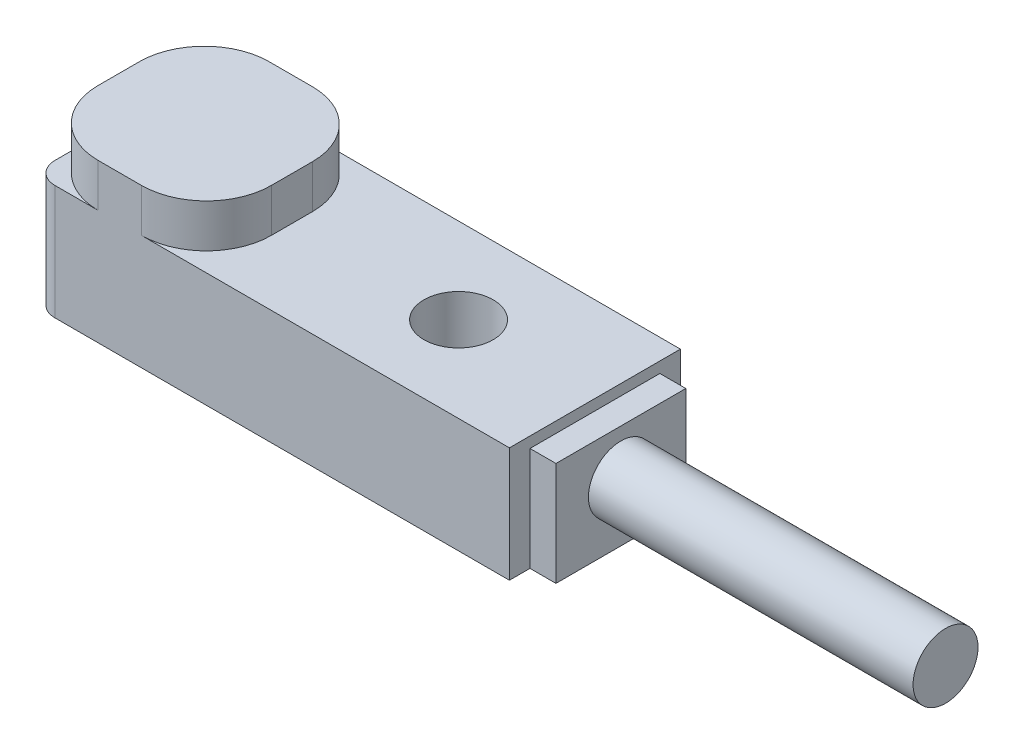
ISO-10303-21;
HEADER;
FILE_DESCRIPTION(('STEP AP214'),'2;1');
FILE_NAME('part.step','',(''),(''),'','','');
FILE_SCHEMA(('AUTOMOTIVE_DESIGN { 1 0 10303 214 1 1 1 1 }'));
ENDSEC;
DATA;
#1=APPLICATION_CONTEXT('core data for automotive mechanical design processes');
#2=APPLICATION_PROTOCOL_DEFINITION('international standard','automotive_design',2000,#1);
#3=PRODUCT_CONTEXT('',#1,'mechanical');
#4=PRODUCT('Part','Part','',(#3));
#5=PRODUCT_RELATED_PRODUCT_CATEGORY('part','',(#4));
#6=PRODUCT_DEFINITION_FORMATION('','',#4);
#7=PRODUCT_DEFINITION_CONTEXT('part definition',#1,'design');
#8=PRODUCT_DEFINITION('design','',#6,#7);
#9=PRODUCT_DEFINITION_SHAPE('','',#8);
#10=(LENGTH_UNIT() NAMED_UNIT(*) SI_UNIT(.MILLI.,.METRE.));
#11=(NAMED_UNIT(*) PLANE_ANGLE_UNIT() SI_UNIT($,.RADIAN.));
#12=(NAMED_UNIT(*) SI_UNIT($,.STERADIAN.) SOLID_ANGLE_UNIT());
#13=UNCERTAINTY_MEASURE_WITH_UNIT(LENGTH_MEASURE(1.E-05),#10,'distance_accuracy_value','');
#14=(GEOMETRIC_REPRESENTATION_CONTEXT(3) GLOBAL_UNCERTAINTY_ASSIGNED_CONTEXT((#13)) GLOBAL_UNIT_ASSIGNED_CONTEXT((#10,
#11,#12)) REPRESENTATION_CONTEXT('',''));
#15=CARTESIAN_POINT('',(0.,0.,0.));
#16=DIRECTION('',(0.,0.,1.));
#17=DIRECTION('',(1.,0.,0.));
#18=AXIS2_PLACEMENT_3D('',#15,#16,#17);
#19=CARTESIAN_POINT('',(0.,5.3,3.95));
#20=DIRECTION('',(0.,0.,1.));
#21=DIRECTION('',(1.,0.,0.));
#22=AXIS2_PLACEMENT_3D('',#19,#20,#21);
#23=PLANE('',#22);
#24=DIRECTION('',(-1.,0.,0.));
#25=VECTOR('',#24,1.);
#26=CARTESIAN_POINT('',(0.,5.3,3.95));
#27=LINE('',#26,#25);
#28=CARTESIAN_POINT('',(-0.999999999999979,5.29999999999999,3.95));
#29=VERTEX_POINT('',#28);
#30=CARTESIAN_POINT('',(-3.,5.3,3.95));
#31=VERTEX_POINT('',#30);
#32=EDGE_CURVE('E240',#29,#31,#27,.T.);
#33=ORIENTED_EDGE('',*,*,#32,.T.);
#34=DIRECTION('',(0.,-1.,0.));
#35=VECTOR('',#34,1.);
#36=CARTESIAN_POINT('',(-3.,0.,3.95));
#37=LINE('',#36,#35);
#38=CARTESIAN_POINT('',(-3.,0.,3.95));
#39=VERTEX_POINT('',#38);
#40=EDGE_CURVE('E284',#31,#39,#37,.T.);
#41=ORIENTED_EDGE('',*,*,#40,.T.);
#42=DIRECTION('',(-1.,0.,0.));
#43=VECTOR('',#42,1.);
#44=CARTESIAN_POINT('',(0.,0.,3.95));
#45=LINE('',#44,#43);
#46=CARTESIAN_POINT('',(18.,0.,3.95));
#47=VERTEX_POINT('',#46);
#48=EDGE_CURVE('E263',#47,#39,#45,.T.);
#49=ORIENTED_EDGE('',*,*,#48,.F.);
#50=DIRECTION('',(0.,-1.,0.));
#51=VECTOR('',#50,1.);
#52=CARTESIAN_POINT('',(18.,5.3,3.95));
#53=LINE('',#52,#51);
#54=CARTESIAN_POINT('',(18.,5.3,3.95));
#55=VERTEX_POINT('',#54);
#56=EDGE_CURVE('E282',#55,#47,#53,.T.);
#57=ORIENTED_EDGE('',*,*,#56,.F.);
#58=DIRECTION('',(-1.,0.,0.));
#59=VECTOR('',#58,1.);
#60=CARTESIAN_POINT('',(0.,5.3,3.95));
#61=LINE('',#60,#59);
#62=CARTESIAN_POINT('',(0.999999999999978,5.3,3.95));
#63=VERTEX_POINT('',#62);
#64=EDGE_CURVE('E264',#55,#63,#61,.T.);
#65=ORIENTED_EDGE('',*,*,#64,.T.);
#66=DIRECTION('',(0.,1.,0.));
#67=VECTOR('',#66,1.);
#68=CARTESIAN_POINT('',(0.999999999999979,-18.6452629374497,3.95));
#69=LINE('',#68,#67);
#70=CARTESIAN_POINT('',(0.999999999999979,7.3,3.95));
#71=VERTEX_POINT('',#70);
#72=EDGE_CURVE('E236',#63,#71,#69,.T.);
#73=ORIENTED_EDGE('',*,*,#72,.T.);
#74=DIRECTION('',(1.,0.,0.));
#75=VECTOR('',#74,1.);
#76=CARTESIAN_POINT('',(0.,7.3,3.95));
#77=LINE('',#76,#75);
#78=CARTESIAN_POINT('',(-1.,7.3,3.95));
#79=VERTEX_POINT('',#78);
#80=EDGE_CURVE('E257',#79,#71,#77,.T.);
#81=ORIENTED_EDGE('',*,*,#80,.F.);
#82=DIRECTION('',(0.,1.,0.));
#83=VECTOR('',#82,1.);
#84=CARTESIAN_POINT('',(-0.999999999999979,-18.6452629374497,3.95));
#85=LINE('',#84,#83);
#86=EDGE_CURVE('E221',#29,#79,#85,.T.);
#87=ORIENTED_EDGE('',*,*,#86,.F.);
#88=EDGE_LOOP('',(#33,#41,#49,#57,#65,#73,#81,#87));
#89=FACE_BOUND('',#88,.T.);
#90=ADVANCED_FACE('F36',(#89),#23,.T.);
#91=CARTESIAN_POINT('',(0.,5.3,-3.95));
#92=DIRECTION('',(0.,0.,-1.));
#93=DIRECTION('',(-1.,0.,0.));
#94=AXIS2_PLACEMENT_3D('',#91,#92,#93);
#95=PLANE('',#94);
#96=DIRECTION('',(1.,0.,0.));
#97=VECTOR('',#96,1.);
#98=CARTESIAN_POINT('',(0.,0.,-3.95));
#99=LINE('',#98,#97);
#100=CARTESIAN_POINT('',(-3.,0.,-3.95));
#101=VERTEX_POINT('',#100);
#102=CARTESIAN_POINT('',(18.,0.,-3.95));
#103=VERTEX_POINT('',#102);
#104=EDGE_CURVE('E276',#101,#103,#99,.T.);
#105=ORIENTED_EDGE('',*,*,#104,.F.);
#106=DIRECTION('',(0.,-1.,0.));
#107=VECTOR('',#106,1.);
#108=CARTESIAN_POINT('',(-3.,5.3,-3.95));
#109=LINE('',#108,#107);
#110=CARTESIAN_POINT('',(-3.,5.3,-3.95));
#111=VERTEX_POINT('',#110);
#112=EDGE_CURVE('E297',#101,#111,#109,.F.);
#113=ORIENTED_EDGE('',*,*,#112,.T.);
#114=DIRECTION('',(1.,0.,0.));
#115=VECTOR('',#114,1.);
#116=CARTESIAN_POINT('',(0.,5.3,-3.95));
#117=LINE('',#116,#115);
#118=CARTESIAN_POINT('',(-0.999999999999978,5.3,-3.95));
#119=VERTEX_POINT('',#118);
#120=EDGE_CURVE('E244',#111,#119,#117,.T.);
#121=ORIENTED_EDGE('',*,*,#120,.T.);
#122=DIRECTION('',(0.,1.,0.));
#123=VECTOR('',#122,1.);
#124=CARTESIAN_POINT('',(-0.999999999999979,-18.6452629374497,-3.95));
#125=LINE('',#124,#123);
#126=CARTESIAN_POINT('',(-0.999999999999979,7.3,-3.95));
#127=VERTEX_POINT('',#126);
#128=EDGE_CURVE('E226',#119,#127,#125,.T.);
#129=ORIENTED_EDGE('',*,*,#128,.T.);
#130=DIRECTION('',(1.,0.,0.));
#131=VECTOR('',#130,1.);
#132=CARTESIAN_POINT('',(0.,7.3,-3.95));
#133=LINE('',#132,#131);
#134=CARTESIAN_POINT('',(0.999999999999979,7.3,-3.95));
#135=VERTEX_POINT('',#134);
#136=EDGE_CURVE('E251',#127,#135,#133,.T.);
#137=ORIENTED_EDGE('',*,*,#136,.T.);
#138=DIRECTION('',(0.,1.,0.));
#139=VECTOR('',#138,1.);
#140=CARTESIAN_POINT('',(0.999999999999979,-18.6452629374497,-3.95));
#141=LINE('',#140,#139);
#142=CARTESIAN_POINT('',(0.999999999999979,5.3,-3.95));
#143=VERTEX_POINT('',#142);
#144=EDGE_CURVE('E229',#143,#135,#141,.T.);
#145=ORIENTED_EDGE('',*,*,#144,.F.);
#146=DIRECTION('',(1.,0.,0.));
#147=VECTOR('',#146,1.);
#148=CARTESIAN_POINT('',(0.,5.3,-3.95));
#149=LINE('',#148,#147);
#150=CARTESIAN_POINT('',(18.,5.3,-3.95));
#151=VERTEX_POINT('',#150);
#152=EDGE_CURVE('E270',#143,#151,#149,.T.);
#153=ORIENTED_EDGE('',*,*,#152,.T.);
#154=DIRECTION('',(0.,-1.,0.));
#155=VECTOR('',#154,1.);
#156=CARTESIAN_POINT('',(18.,5.3,-3.95));
#157=LINE('',#156,#155);
#158=EDGE_CURVE('E272',#151,#103,#157,.T.);
#159=ORIENTED_EDGE('',*,*,#158,.T.);
#160=EDGE_LOOP('',(#105,#113,#121,#129,#137,#145,#153,#159));
#161=FACE_BOUND('',#160,.T.);
#162=ADVANCED_FACE('F314',(#161),#95,.T.);
#163=CARTESIAN_POINT('',(-4.,5.3,0.));
#164=DIRECTION('',(1.,0.,0.));
#165=DIRECTION('',(0.,0.,-1.));
#166=AXIS2_PLACEMENT_3D('',#163,#164,#165);
#167=PLANE('',#166);
#168=DIRECTION('',(0.,0.,1.));
#169=VECTOR('',#168,1.);
#170=CARTESIAN_POINT('',(-4.,0.,0.));
#171=LINE('',#170,#169);
#172=CARTESIAN_POINT('',(-4.,0.,-2.95));
#173=VERTEX_POINT('',#172);
#174=CARTESIAN_POINT('',(-4.,0.,2.95));
#175=VERTEX_POINT('',#174);
#176=EDGE_CURVE('E267',#173,#175,#171,.T.);
#177=ORIENTED_EDGE('',*,*,#176,.T.);
#178=DIRECTION('',(0.,-1.,0.));
#179=VECTOR('',#178,1.);
#180=CARTESIAN_POINT('',(-4.,5.3,2.95));
#181=LINE('',#180,#179);
#182=CARTESIAN_POINT('',(-4.,5.3,2.95));
#183=VERTEX_POINT('',#182);
#184=EDGE_CURVE('E294',#175,#183,#181,.F.);
#185=ORIENTED_EDGE('',*,*,#184,.T.);
#186=DIRECTION('',(0.,0.,1.));
#187=VECTOR('',#186,1.);
#188=CARTESIAN_POINT('',(-4.,5.3,0.));
#189=LINE('',#188,#187);
#190=CARTESIAN_POINT('',(-4.,5.3,0.949999999999979));
#191=VERTEX_POINT('',#190);
#192=EDGE_CURVE('E199',#191,#183,#189,.T.);
#193=ORIENTED_EDGE('',*,*,#192,.F.);
#194=DIRECTION('',(0.,1.,0.));
#195=VECTOR('',#194,1.);
#196=CARTESIAN_POINT('',(-4.,-18.6452629374497,0.949999999999979));
#197=LINE('',#196,#195);
#198=CARTESIAN_POINT('',(-4.,7.3,0.949999999999979));
#199=VERTEX_POINT('',#198);
#200=EDGE_CURVE('E209',#191,#199,#197,.T.);
#201=ORIENTED_EDGE('',*,*,#200,.T.);
#202=DIRECTION('',(0.,0.,1.));
#203=VECTOR('',#202,1.);
#204=CARTESIAN_POINT('',(-4.,7.3,0.));
#205=LINE('',#204,#203);
#206=CARTESIAN_POINT('',(-4.,7.3,-0.949999999999979));
#207=VERTEX_POINT('',#206);
#208=EDGE_CURVE('E254',#207,#199,#205,.T.);
#209=ORIENTED_EDGE('',*,*,#208,.F.);
#210=DIRECTION('',(0.,1.,0.));
#211=VECTOR('',#210,1.);
#212=CARTESIAN_POINT('',(-4.,-18.6452629374497,-0.949999999999979));
#213=LINE('',#212,#211);
#214=CARTESIAN_POINT('',(-4.,5.3,-0.949999999999979));
#215=VERTEX_POINT('',#214);
#216=EDGE_CURVE('E224',#215,#207,#213,.T.);
#217=ORIENTED_EDGE('',*,*,#216,.F.);
#218=CARTESIAN_POINT('',(-4.,5.3,-2.95));
#219=VERTEX_POINT('',#218);
#220=EDGE_CURVE('E243',#219,#215,#189,.T.);
#221=ORIENTED_EDGE('',*,*,#220,.F.);
#222=DIRECTION('',(0.,-1.,0.));
#223=VECTOR('',#222,1.);
#224=CARTESIAN_POINT('',(-4.,0.,-2.95));
#225=LINE('',#224,#223);
#226=EDGE_CURVE('E291',#219,#173,#225,.T.);
#227=ORIENTED_EDGE('',*,*,#226,.T.);
#228=EDGE_LOOP('',(#177,#185,#193,#201,#209,#217,#221,#227));
#229=FACE_BOUND('',#228,.T.);
#230=ADVANCED_FACE('F311',(#229),#167,.F.);
#231=CARTESIAN_POINT('',(4.,7.3,0.));
#232=DIRECTION('',(1.,0.,0.));
#233=DIRECTION('',(0.,0.,-1.));
#234=AXIS2_PLACEMENT_3D('',#231,#232,#233);
#235=PLANE('',#234);
#236=DIRECTION('',(0.,1.,0.));
#237=VECTOR('',#236,1.);
#238=CARTESIAN_POINT('',(4.,-18.6452629374497,0.94999999999998));
#239=LINE('',#238,#237);
#240=CARTESIAN_POINT('',(4.,5.3,0.94999999999998));
#241=VERTEX_POINT('',#240);
#242=CARTESIAN_POINT('',(4.,7.3,0.94999999999998));
#243=VERTEX_POINT('',#242);
#244=EDGE_CURVE('E234',#241,#243,#239,.T.);
#245=ORIENTED_EDGE('',*,*,#244,.F.);
#246=DIRECTION('',(0.,0.,-1.));
#247=VECTOR('',#246,1.);
#248=CARTESIAN_POINT('',(4.,5.3,0.));
#249=LINE('',#248,#247);
#250=CARTESIAN_POINT('',(4.,5.3,-0.949999999999979));
#251=VERTEX_POINT('',#250);
#252=EDGE_CURVE('E260',#241,#251,#249,.T.);
#253=ORIENTED_EDGE('',*,*,#252,.T.);
#254=DIRECTION('',(0.,1.,0.));
#255=VECTOR('',#254,1.);
#256=CARTESIAN_POINT('',(4.,-18.6452629374497,-0.949999999999979));
#257=LINE('',#256,#255);
#258=CARTESIAN_POINT('',(4.,7.3,-0.949999999999979));
#259=VERTEX_POINT('',#258);
#260=EDGE_CURVE('E231',#251,#259,#257,.T.);
#261=ORIENTED_EDGE('',*,*,#260,.T.);
#262=DIRECTION('',(0.,0.,1.));
#263=VECTOR('',#262,1.);
#264=CARTESIAN_POINT('',(4.,7.3,0.));
#265=LINE('',#264,#263);
#266=EDGE_CURVE('E246',#259,#243,#265,.T.);
#267=ORIENTED_EDGE('',*,*,#266,.T.);
#268=EDGE_LOOP('',(#245,#253,#261,#267));
#269=FACE_BOUND('',#268,.T.);
#270=ADVANCED_FACE('F389',(#269),#235,.T.);
#271=CARTESIAN_POINT('',(0.,7.3,0.));
#272=DIRECTION('',(0.,1.,0.));
#273=DIRECTION('',(0.,0.,1.));
#274=AXIS2_PLACEMENT_3D('',#271,#272,#273);
#275=PLANE('',#274);
#276=ORIENTED_EDGE('',*,*,#80,.T.);
#277=CARTESIAN_POINT('',(1.,7.3,0.95));
#278=DIRECTION('',(0.,1.,0.));
#279=DIRECTION('',(0.,0.,-1.));
#280=AXIS2_PLACEMENT_3D('',#277,#278,#279);
#281=CIRCLE('',#280,3.);
#282=EDGE_CURVE('E212',#71,#243,#281,.T.);
#283=ORIENTED_EDGE('',*,*,#282,.T.);
#284=ORIENTED_EDGE('',*,*,#266,.F.);
#285=CARTESIAN_POINT('',(1.,7.3,-0.950000000000001));
#286=DIRECTION('',(0.,1.,0.));
#287=DIRECTION('',(0.,0.,1.));
#288=AXIS2_PLACEMENT_3D('',#285,#286,#287);
#289=CIRCLE('',#288,3.);
#290=EDGE_CURVE('E215',#259,#135,#289,.T.);
#291=ORIENTED_EDGE('',*,*,#290,.T.);
#292=ORIENTED_EDGE('',*,*,#136,.F.);
#293=CARTESIAN_POINT('',(-1.,7.3,-0.950000000000001));
#294=DIRECTION('',(0.,1.,0.));
#295=DIRECTION('',(0.,0.,1.));
#296=AXIS2_PLACEMENT_3D('',#293,#294,#295);
#297=CIRCLE('',#296,3.);
#298=EDGE_CURVE('E218',#127,#207,#297,.T.);
#299=ORIENTED_EDGE('',*,*,#298,.T.);
#300=ORIENTED_EDGE('',*,*,#208,.T.);
#301=CARTESIAN_POINT('',(-1.,7.3,0.950000000000001));
#302=DIRECTION('',(0.,1.,0.));
#303=DIRECTION('',(0.,0.,1.));
#304=AXIS2_PLACEMENT_3D('',#301,#302,#303);
#305=CIRCLE('',#304,3.);
#306=EDGE_CURVE('E195',#199,#79,#305,.T.);
#307=ORIENTED_EDGE('',*,*,#306,.T.);
#308=EDGE_LOOP('',(#276,#283,#284,#291,#292,#299,#300,#307));
#309=FACE_BOUND('',#308,.T.);
#310=ADVANCED_FACE('F378',(#309),#275,.T.);
#311=CARTESIAN_POINT('',(18.,5.3,0.));
#312=DIRECTION('',(1.,0.,0.));
#313=DIRECTION('',(0.,0.,-1.));
#314=AXIS2_PLACEMENT_3D('',#311,#312,#313);
#315=PLANE('',#314);
#316=DIRECTION('',(0.,-1.,0.));
#317=VECTOR('',#316,1.);
#318=CARTESIAN_POINT('',(18.,4.8,3.));
#319=LINE('',#318,#317);
#320=CARTESIAN_POINT('',(18.,4.8,3.));
#321=VERTEX_POINT('',#320);
#322=CARTESIAN_POINT('',(18.,0.,3.));
#323=VERTEX_POINT('',#322);
#324=EDGE_CURVE('E52',#321,#323,#319,.T.);
#325=ORIENTED_EDGE('',*,*,#324,.F.);
#326=DIRECTION('',(0.,0.,1.));
#327=VECTOR('',#326,1.);
#328=CARTESIAN_POINT('',(18.,4.8,3.));
#329=LINE('',#328,#327);
#330=CARTESIAN_POINT('',(18.,4.8,-3.));
#331=VERTEX_POINT('',#330);
#332=EDGE_CURVE('E181',#331,#321,#329,.T.);
#333=ORIENTED_EDGE('',*,*,#332,.F.);
#334=DIRECTION('',(0.,1.,0.));
#335=VECTOR('',#334,1.);
#336=CARTESIAN_POINT('',(18.,4.8,-3.));
#337=LINE('',#336,#335);
#338=CARTESIAN_POINT('',(18.,0.,-3.));
#339=VERTEX_POINT('',#338);
#340=EDGE_CURVE('E321',#339,#331,#337,.T.);
#341=ORIENTED_EDGE('',*,*,#340,.F.);
#342=DIRECTION('',(0.,0.,1.));
#343=VECTOR('',#342,1.);
#344=CARTESIAN_POINT('',(18.,0.,0.));
#345=LINE('',#344,#343);
#346=EDGE_CURVE('E274',#103,#339,#345,.T.);
#347=ORIENTED_EDGE('',*,*,#346,.F.);
#348=ORIENTED_EDGE('',*,*,#158,.F.);
#349=DIRECTION('',(0.,0.,1.));
#350=VECTOR('',#349,1.);
#351=CARTESIAN_POINT('',(18.,5.3,0.));
#352=LINE('',#351,#350);
#353=EDGE_CURVE('E266',#151,#55,#352,.T.);
#354=ORIENTED_EDGE('',*,*,#353,.T.);
#355=ORIENTED_EDGE('',*,*,#56,.T.);
#356=EDGE_CURVE('E57',#323,#47,#345,.T.);
#357=ORIENTED_EDGE('',*,*,#356,.F.);
#358=EDGE_LOOP('',(#325,#333,#341,#347,#348,#354,#355,#357));
#359=FACE_BOUND('',#358,.T.);
#360=ADVANCED_FACE('F319',(#359),#315,.T.);
#361=CARTESIAN_POINT('',(0.,5.3,0.));
#362=DIRECTION('',(0.,1.,0.));
#363=DIRECTION('',(0.,0.,1.));
#364=AXIS2_PLACEMENT_3D('',#361,#362,#363);
#365=PLANE('',#364);
#366=CARTESIAN_POINT('',(11.7,5.3,0.));
#367=DIRECTION('',(0.,1.,0.));
#368=DIRECTION('',(0.,0.,1.));
#369=AXIS2_PLACEMENT_3D('',#366,#367,#368);
#370=CIRCLE('',#369,1.59999999999999);
#371=CARTESIAN_POINT('',(11.7,5.3,1.59999999999999));
#372=VERTEX_POINT('',#371);
#373=EDGE_CURVE('E184',#372,#372,#370,.T.);
#374=ORIENTED_EDGE('',*,*,#373,.F.);
#375=EDGE_LOOP('',(#374));
#376=FACE_BOUND('',#375,.T.);
#377=ORIENTED_EDGE('',*,*,#252,.F.);
#378=CARTESIAN_POINT('',(1.,5.3,0.95));
#379=DIRECTION('',(0.,1.,0.));
#380=DIRECTION('',(0.,0.,1.));
#381=AXIS2_PLACEMENT_3D('',#378,#379,#380);
#382=CIRCLE('',#381,3.);
#383=EDGE_CURVE('E196',#241,#63,#382,.F.);
#384=ORIENTED_EDGE('',*,*,#383,.T.);
#385=ORIENTED_EDGE('',*,*,#64,.F.);
#386=ORIENTED_EDGE('',*,*,#353,.F.);
#387=ORIENTED_EDGE('',*,*,#152,.F.);
#388=CARTESIAN_POINT('',(1.,5.3,-0.950000000000001));
#389=DIRECTION('',(0.,1.,0.));
#390=DIRECTION('',(0.,0.,1.));
#391=AXIS2_PLACEMENT_3D('',#388,#389,#390);
#392=CIRCLE('',#391,3.);
#393=EDGE_CURVE('E200',#143,#251,#392,.F.);
#394=ORIENTED_EDGE('',*,*,#393,.T.);
#395=EDGE_LOOP('',(#377,#384,#385,#386,#387,#394));
#396=FACE_BOUND('',#395,.T.);
#397=ADVANCED_FACE('F392',(#376,#396),#365,.T.);
#398=CARTESIAN_POINT('',(0.,0.,0.));
#399=DIRECTION('',(0.,1.,0.));
#400=DIRECTION('',(0.,0.,1.));
#401=AXIS2_PLACEMENT_3D('',#398,#399,#400);
#402=PLANE('',#401);
#403=CARTESIAN_POINT('',(11.7,0.,0.));
#404=DIRECTION('',(0.,1.,0.));
#405=DIRECTION('',(0.,0.,1.));
#406=AXIS2_PLACEMENT_3D('',#403,#404,#405);
#407=CIRCLE('',#406,1.6);
#408=CARTESIAN_POINT('',(11.7,0.,1.6));
#409=VERTEX_POINT('',#408);
#410=EDGE_CURVE('E187',#409,#409,#407,.T.);
#411=ORIENTED_EDGE('',*,*,#410,.T.);
#412=EDGE_LOOP('',(#411));
#413=FACE_BOUND('',#412,.T.);
#414=ORIENTED_EDGE('',*,*,#48,.T.);
#415=CARTESIAN_POINT('',(-3.,0.,2.95));
#416=DIRECTION('',(0.,1.,0.));
#417=DIRECTION('',(0.,0.,1.));
#418=AXIS2_PLACEMENT_3D('',#415,#416,#417);
#419=CIRCLE('',#418,1.);
#420=EDGE_CURVE('E289',#39,#175,#419,.F.);
#421=ORIENTED_EDGE('',*,*,#420,.T.);
#422=ORIENTED_EDGE('',*,*,#176,.F.);
#423=CARTESIAN_POINT('',(-3.,0.,-2.95));
#424=DIRECTION('',(0.,1.,0.));
#425=DIRECTION('',(0.,0.,1.));
#426=AXIS2_PLACEMENT_3D('',#423,#424,#425);
#427=CIRCLE('',#426,1.);
#428=EDGE_CURVE('E287',#173,#101,#427,.F.);
#429=ORIENTED_EDGE('',*,*,#428,.T.);
#430=ORIENTED_EDGE('',*,*,#104,.T.);
#431=ORIENTED_EDGE('',*,*,#346,.T.);
#432=DIRECTION('',(-1.,0.,0.));
#433=VECTOR('',#432,1.);
#434=CARTESIAN_POINT('',(19.2,0.,-3.));
#435=LINE('',#434,#433);
#436=CARTESIAN_POINT('',(19.2,0.,-3.));
#437=VERTEX_POINT('',#436);
#438=EDGE_CURVE('E168',#437,#339,#435,.T.);
#439=ORIENTED_EDGE('',*,*,#438,.F.);
#440=DIRECTION('',(0.,0.,-1.));
#441=VECTOR('',#440,1.);
#442=CARTESIAN_POINT('',(19.2,0.,3.));
#443=LINE('',#442,#441);
#444=CARTESIAN_POINT('',(19.2,0.,3.));
#445=VERTEX_POINT('',#444);
#446=EDGE_CURVE('E160',#445,#437,#443,.T.);
#447=ORIENTED_EDGE('',*,*,#446,.F.);
#448=DIRECTION('',(-1.,0.,0.));
#449=VECTOR('',#448,1.);
#450=CARTESIAN_POINT('',(19.2,0.,3.));
#451=LINE('',#450,#449);
#452=EDGE_CURVE('E165',#445,#323,#451,.T.);
#453=ORIENTED_EDGE('',*,*,#452,.T.);
#454=ORIENTED_EDGE('',*,*,#356,.T.);
#455=EDGE_LOOP('',(#414,#421,#422,#429,#430,#431,#439,#447,#453,#454));
#456=FACE_BOUND('',#455,.T.);
#457=ADVANCED_FACE('F163',(#413,#456),#402,.F.);
#458=CARTESIAN_POINT('',(-1.,-18.6452629374497,0.950000000000001));
#459=DIRECTION('',(0.,1.,0.));
#460=DIRECTION('',(0.,0.,1.));
#461=AXIS2_PLACEMENT_3D('',#458,#459,#460);
#462=CYLINDRICAL_SURFACE('',#461,3.);
#463=ORIENTED_EDGE('',*,*,#86,.T.);
#464=ORIENTED_EDGE('',*,*,#306,.F.);
#465=ORIENTED_EDGE('',*,*,#200,.F.);
#466=CARTESIAN_POINT('',(-1.,5.3,0.950000000000001));
#467=DIRECTION('',(0.,1.,0.));
#468=DIRECTION('',(0.,0.,1.));
#469=AXIS2_PLACEMENT_3D('',#466,#467,#468);
#470=CIRCLE('',#469,3.);
#471=EDGE_CURVE('E206',#29,#191,#470,.F.);
#472=ORIENTED_EDGE('',*,*,#471,.F.);
#473=EDGE_LOOP('',(#463,#464,#465,#472));
#474=FACE_BOUND('',#473,.T.);
#475=ADVANCED_FACE('F376',(#474),#462,.T.);
#476=ORIENTED_EDGE('',*,*,#192,.T.);
#477=CARTESIAN_POINT('',(-3.,5.3,2.95));
#478=DIRECTION('',(0.,1.,0.));
#479=DIRECTION('',(0.,0.,1.));
#480=AXIS2_PLACEMENT_3D('',#477,#478,#479);
#481=CIRCLE('',#480,1.);
#482=EDGE_CURVE('E296',#183,#31,#481,.T.);
#483=ORIENTED_EDGE('',*,*,#482,.T.);
#484=ORIENTED_EDGE('',*,*,#32,.F.);
#485=ORIENTED_EDGE('',*,*,#471,.T.);
#486=EDGE_LOOP('',(#476,#483,#484,#485));
#487=FACE_BOUND('',#486,.T.);
#488=ADVANCED_FACE('F369',(#487),#365,.T.);
#489=CARTESIAN_POINT('',(-1.,-18.6452629374497,-0.950000000000001));
#490=DIRECTION('',(0.,1.,0.));
#491=DIRECTION('',(0.,0.,1.));
#492=AXIS2_PLACEMENT_3D('',#489,#490,#491);
#493=CYLINDRICAL_SURFACE('',#492,3.);
#494=ORIENTED_EDGE('',*,*,#216,.T.);
#495=ORIENTED_EDGE('',*,*,#298,.F.);
#496=ORIENTED_EDGE('',*,*,#128,.F.);
#497=CARTESIAN_POINT('',(-1.,5.3,-0.950000000000001));
#498=DIRECTION('',(0.,1.,0.));
#499=DIRECTION('',(0.,0.,1.));
#500=AXIS2_PLACEMENT_3D('',#497,#498,#499);
#501=CIRCLE('',#500,3.);
#502=EDGE_CURVE('E203',#215,#119,#501,.F.);
#503=ORIENTED_EDGE('',*,*,#502,.F.);
#504=EDGE_LOOP('',(#494,#495,#496,#503));
#505=FACE_BOUND('',#504,.T.);
#506=ADVANCED_FACE('F382',(#505),#493,.T.);
#507=ORIENTED_EDGE('',*,*,#120,.F.);
#508=CARTESIAN_POINT('',(-3.,5.3,-2.95));
#509=DIRECTION('',(0.,1.,0.));
#510=DIRECTION('',(0.,0.,1.));
#511=AXIS2_PLACEMENT_3D('',#508,#509,#510);
#512=CIRCLE('',#511,1.);
#513=EDGE_CURVE('E40',#111,#219,#512,.T.);
#514=ORIENTED_EDGE('',*,*,#513,.T.);
#515=ORIENTED_EDGE('',*,*,#220,.T.);
#516=ORIENTED_EDGE('',*,*,#502,.T.);
#517=EDGE_LOOP('',(#507,#514,#515,#516));
#518=FACE_BOUND('',#517,.T.);
#519=ADVANCED_FACE('F305',(#518),#365,.T.);
#520=CARTESIAN_POINT('',(1.,-18.6452629374497,-0.950000000000001));
#521=DIRECTION('',(0.,1.,0.));
#522=DIRECTION('',(0.,0.,1.));
#523=AXIS2_PLACEMENT_3D('',#520,#521,#522);
#524=CYLINDRICAL_SURFACE('',#523,3.);
#525=ORIENTED_EDGE('',*,*,#144,.T.);
#526=ORIENTED_EDGE('',*,*,#290,.F.);
#527=ORIENTED_EDGE('',*,*,#260,.F.);
#528=ORIENTED_EDGE('',*,*,#393,.F.);
#529=EDGE_LOOP('',(#525,#526,#527,#528));
#530=FACE_BOUND('',#529,.T.);
#531=ADVANCED_FACE('F385',(#530),#524,.T.);
#532=CARTESIAN_POINT('',(1.,-18.6452629374497,0.95));
#533=DIRECTION('',(0.,1.,0.));
#534=DIRECTION('',(0.,0.,1.));
#535=AXIS2_PLACEMENT_3D('',#532,#533,#534);
#536=CYLINDRICAL_SURFACE('',#535,3.);
#537=ORIENTED_EDGE('',*,*,#244,.T.);
#538=ORIENTED_EDGE('',*,*,#282,.F.);
#539=ORIENTED_EDGE('',*,*,#72,.F.);
#540=ORIENTED_EDGE('',*,*,#383,.F.);
#541=EDGE_LOOP('',(#537,#538,#539,#540));
#542=FACE_BOUND('',#541,.T.);
#543=ADVANCED_FACE('F362',(#542),#536,.T.);
#544=CARTESIAN_POINT('',(11.7,5.3,0.));
#545=DIRECTION('',(0.,1.,0.));
#546=DIRECTION('',(0.,0.,1.));
#547=AXIS2_PLACEMENT_3D('',#544,#545,#546);
#548=CYLINDRICAL_SURFACE('',#547,1.59999999999999);
#549=ORIENTED_EDGE('',*,*,#410,.F.);
#550=EDGE_LOOP('',(#549));
#551=FACE_BOUND('',#550,.T.);
#552=ORIENTED_EDGE('',*,*,#373,.T.);
#553=EDGE_LOOP('',(#552));
#554=FACE_BOUND('',#553,.T.);
#555=ADVANCED_FACE('F356',(#551,#554),#548,.F.);
#556=CARTESIAN_POINT('',(-3.,5.3,2.95));
#557=DIRECTION('',(0.,1.,0.));
#558=DIRECTION('',(0.,0.,1.));
#559=AXIS2_PLACEMENT_3D('',#556,#557,#558);
#560=CYLINDRICAL_SURFACE('',#559,1.);
#561=ORIENTED_EDGE('',*,*,#482,.F.);
#562=ORIENTED_EDGE('',*,*,#184,.F.);
#563=ORIENTED_EDGE('',*,*,#420,.F.);
#564=ORIENTED_EDGE('',*,*,#40,.F.);
#565=EDGE_LOOP('',(#561,#562,#563,#564));
#566=FACE_BOUND('',#565,.T.);
#567=ADVANCED_FACE('F354',(#566),#560,.T.);
#568=CARTESIAN_POINT('',(-3.,5.3,-2.95));
#569=DIRECTION('',(0.,1.,0.));
#570=DIRECTION('',(0.,0.,1.));
#571=AXIS2_PLACEMENT_3D('',#568,#569,#570);
#572=CYLINDRICAL_SURFACE('',#571,1.);
#573=ORIENTED_EDGE('',*,*,#513,.F.);
#574=ORIENTED_EDGE('',*,*,#112,.F.);
#575=ORIENTED_EDGE('',*,*,#428,.F.);
#576=ORIENTED_EDGE('',*,*,#226,.F.);
#577=EDGE_LOOP('',(#573,#574,#575,#576));
#578=FACE_BOUND('',#577,.T.);
#579=ADVANCED_FACE('F38',(#578),#572,.T.);
#580=CARTESIAN_POINT('',(19.2,4.8,3.));
#581=DIRECTION('',(0.,0.,-1.));
#582=DIRECTION('',(0.,1.,0.));
#583=AXIS2_PLACEMENT_3D('',#580,#581,#582);
#584=PLANE('',#583);
#585=ORIENTED_EDGE('',*,*,#324,.T.);
#586=ORIENTED_EDGE('',*,*,#452,.F.);
#587=DIRECTION('',(0.,-1.,0.));
#588=VECTOR('',#587,1.);
#589=CARTESIAN_POINT('',(19.2,4.8,3.));
#590=LINE('',#589,#588);
#591=CARTESIAN_POINT('',(19.2,4.8,3.));
#592=VERTEX_POINT('',#591);
#593=EDGE_CURVE('E172',#592,#445,#590,.T.);
#594=ORIENTED_EDGE('',*,*,#593,.F.);
#595=DIRECTION('',(-1.,0.,0.));
#596=VECTOR('',#595,1.);
#597=CARTESIAN_POINT('',(19.2,4.8,3.));
#598=LINE('',#597,#596);
#599=EDGE_CURVE('E327',#592,#321,#598,.T.);
#600=ORIENTED_EDGE('',*,*,#599,.T.);
#601=EDGE_LOOP('',(#585,#586,#594,#600));
#602=FACE_BOUND('',#601,.T.);
#603=ADVANCED_FACE('F183',(#602),#584,.F.);
#604=CARTESIAN_POINT('',(19.2,4.8,-3.));
#605=DIRECTION('',(0.,0.,1.));
#606=DIRECTION('',(0.,-1.,0.));
#607=AXIS2_PLACEMENT_3D('',#604,#605,#606);
#608=PLANE('',#607);
#609=ORIENTED_EDGE('',*,*,#340,.T.);
#610=DIRECTION('',(-1.,0.,0.));
#611=VECTOR('',#610,1.);
#612=CARTESIAN_POINT('',(19.2,4.8,-3.));
#613=LINE('',#612,#611);
#614=CARTESIAN_POINT('',(19.2,4.8,-3.));
#615=VERTEX_POINT('',#614);
#616=EDGE_CURVE('E189',#615,#331,#613,.T.);
#617=ORIENTED_EDGE('',*,*,#616,.F.);
#618=DIRECTION('',(0.,1.,0.));
#619=VECTOR('',#618,1.);
#620=CARTESIAN_POINT('',(19.2,4.8,-3.));
#621=LINE('',#620,#619);
#622=EDGE_CURVE('E171',#437,#615,#621,.T.);
#623=ORIENTED_EDGE('',*,*,#622,.F.);
#624=ORIENTED_EDGE('',*,*,#438,.T.);
#625=EDGE_LOOP('',(#609,#617,#623,#624));
#626=FACE_BOUND('',#625,.T.);
#627=ADVANCED_FACE('F323',(#626),#608,.F.);
#628=CARTESIAN_POINT('',(19.2,4.8,3.));
#629=DIRECTION('',(0.,-1.,0.));
#630=DIRECTION('',(0.,0.,-1.));
#631=AXIS2_PLACEMENT_3D('',#628,#629,#630);
#632=PLANE('',#631);
#633=ORIENTED_EDGE('',*,*,#332,.T.);
#634=ORIENTED_EDGE('',*,*,#599,.F.);
#635=DIRECTION('',(0.,0.,1.));
#636=VECTOR('',#635,1.);
#637=CARTESIAN_POINT('',(19.2,4.8,3.));
#638=LINE('',#637,#636);
#639=EDGE_CURVE('E177',#615,#592,#638,.T.);
#640=ORIENTED_EDGE('',*,*,#639,.F.);
#641=ORIENTED_EDGE('',*,*,#616,.T.);
#642=EDGE_LOOP('',(#633,#634,#640,#641));
#643=FACE_BOUND('',#642,.T.);
#644=ADVANCED_FACE('F335',(#643),#632,.F.);
#645=CARTESIAN_POINT('',(19.2,0.,0.));
#646=DIRECTION('',(1.,0.,0.));
#647=DIRECTION('',(0.,0.,-1.));
#648=AXIS2_PLACEMENT_3D('',#645,#646,#647);
#649=PLANE('',#648);
#650=CARTESIAN_POINT('',(19.2,2.7,0.));
#651=DIRECTION('',(1.,0.,0.));
#652=DIRECTION('',(0.,0.,-1.));
#653=AXIS2_PLACEMENT_3D('',#650,#651,#652);
#654=CIRCLE('',#653,1.5);
#655=CARTESIAN_POINT('',(19.2,2.7,-1.5));
#656=VERTEX_POINT('',#655);
#657=EDGE_CURVE('E12',#656,#656,#654,.T.);
#658=ORIENTED_EDGE('',*,*,#657,.F.);
#659=EDGE_LOOP('',(#658));
#660=FACE_BOUND('',#659,.T.);
#661=ORIENTED_EDGE('',*,*,#593,.T.);
#662=ORIENTED_EDGE('',*,*,#446,.T.);
#663=ORIENTED_EDGE('',*,*,#622,.T.);
#664=ORIENTED_EDGE('',*,*,#639,.T.);
#665=EDGE_LOOP('',(#661,#662,#663,#664));
#666=FACE_BOUND('',#665,.T.);
#667=ADVANCED_FACE('F175',(#660,#666),#649,.T.);
#668=CARTESIAN_POINT('',(34.2,2.7,0.));
#669=DIRECTION('',(-1.,0.,0.));
#670=DIRECTION('',(0.,0.,1.));
#671=AXIS2_PLACEMENT_3D('',#668,#669,#670);
#672=CYLINDRICAL_SURFACE('',#671,1.5);
#673=CARTESIAN_POINT('',(34.2,2.7,0.));
#674=DIRECTION('',(1.,0.,0.));
#675=DIRECTION('',(0.,0.,-1.));
#676=AXIS2_PLACEMENT_3D('',#673,#674,#675);
#677=CIRCLE('',#676,1.5);
#678=CARTESIAN_POINT('',(34.2,2.7,-1.5));
#679=VERTEX_POINT('',#678);
#680=EDGE_CURVE('E331',#679,#679,#677,.T.);
#681=ORIENTED_EDGE('',*,*,#680,.F.);
#682=EDGE_LOOP('',(#681));
#683=FACE_BOUND('',#682,.T.);
#684=ORIENTED_EDGE('',*,*,#657,.T.);
#685=EDGE_LOOP('',(#684));
#686=FACE_BOUND('',#685,.T.);
#687=ADVANCED_FACE('F342',(#683,#686),#672,.T.);
#688=CARTESIAN_POINT('',(34.2,2.7,0.));
#689=DIRECTION('',(1.,0.,0.));
#690=DIRECTION('',(0.,0.,-1.));
#691=AXIS2_PLACEMENT_3D('',#688,#689,#690);
#692=PLANE('',#691);
#693=ORIENTED_EDGE('',*,*,#680,.T.);
#694=EDGE_LOOP('',(#693));
#695=FACE_BOUND('',#694,.T.);
#696=ADVANCED_FACE('F520',(#695),#692,.T.);
#697=CLOSED_SHELL('',(#90,#162,#230,#270,#310,#360,#397,#457,#475,#488,#506,#519,#531,#543,#555,
#567,#579,#603,#627,#644,#667,#687,#696));
#698=MANIFOLD_SOLID_BREP('B2',#697);
#699=ADVANCED_BREP_SHAPE_REPRESENTATION('',(#18,#698),#14);
#700=SHAPE_DEFINITION_REPRESENTATION(#9,#699);
ENDSEC;
END-ISO-10303-21;
